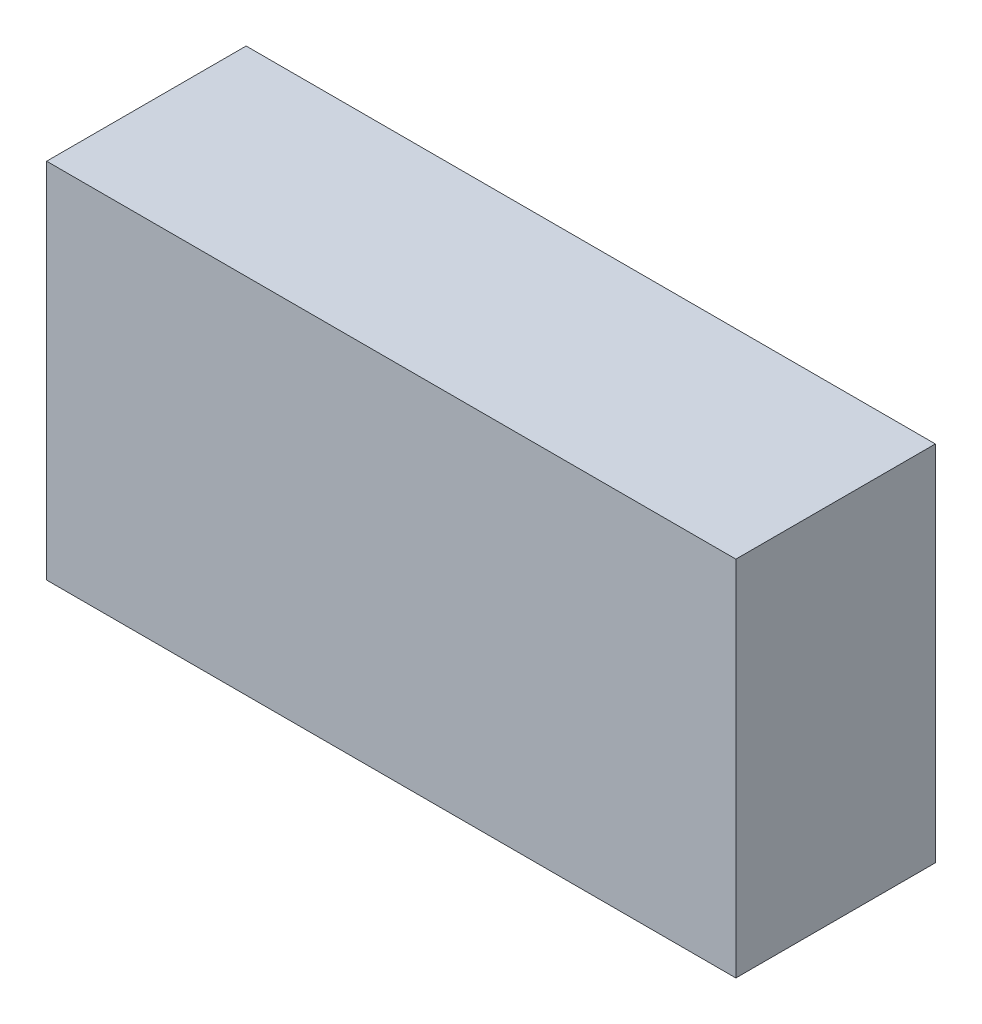
ISO-10303-21;
HEADER;
FILE_DESCRIPTION(('STEP AP214'),'2;1');
FILE_NAME('part.step','',(''),(''),'','','');
FILE_SCHEMA(('AUTOMOTIVE_DESIGN { 1 0 10303 214 1 1 1 1 }'));
ENDSEC;
DATA;
#1=APPLICATION_CONTEXT('core data for automotive mechanical design processes');
#2=APPLICATION_PROTOCOL_DEFINITION('international standard','automotive_design',2000,#1);
#3=PRODUCT_CONTEXT('',#1,'mechanical');
#4=PRODUCT('Part','Part','',(#3));
#5=PRODUCT_RELATED_PRODUCT_CATEGORY('part','',(#4));
#6=PRODUCT_DEFINITION_FORMATION('','',#4);
#7=PRODUCT_DEFINITION_CONTEXT('part definition',#1,'design');
#8=PRODUCT_DEFINITION('design','',#6,#7);
#9=PRODUCT_DEFINITION_SHAPE('','',#8);
#10=(LENGTH_UNIT() NAMED_UNIT(*) SI_UNIT(.MILLI.,.METRE.));
#11=(NAMED_UNIT(*) PLANE_ANGLE_UNIT() SI_UNIT($,.RADIAN.));
#12=(NAMED_UNIT(*) SI_UNIT($,.STERADIAN.) SOLID_ANGLE_UNIT());
#13=UNCERTAINTY_MEASURE_WITH_UNIT(LENGTH_MEASURE(1.E-05),#10,'distance_accuracy_value','');
#14=(GEOMETRIC_REPRESENTATION_CONTEXT(3) GLOBAL_UNCERTAINTY_ASSIGNED_CONTEXT((#13)) GLOBAL_UNIT_ASSIGNED_CONTEXT((#10,
#11,#12)) REPRESENTATION_CONTEXT('',''));
#15=CARTESIAN_POINT('',(0.,0.,0.));
#16=DIRECTION('',(0.,0.,1.));
#17=DIRECTION('',(1.,0.,0.));
#18=AXIS2_PLACEMENT_3D('',#15,#16,#17);
#19=CARTESIAN_POINT('',(0.,0.,11.));
#20=DIRECTION('',(1.,0.,0.));
#21=DIRECTION('',(0.,1.,0.));
#22=AXIS2_PLACEMENT_3D('',#19,#20,#21);
#23=PLANE('',#22);
#24=DIRECTION('',(0.,-1.,0.));
#25=VECTOR('',#24,1.);
#26=CARTESIAN_POINT('',(0.,0.,0.));
#27=LINE('',#26,#25);
#28=CARTESIAN_POINT('',(0.,0.,0.));
#29=VERTEX_POINT('',#28);
#30=CARTESIAN_POINT('',(0.,-20.,0.));
#31=VERTEX_POINT('',#30);
#32=EDGE_CURVE('E106',#29,#31,#27,.T.);
#33=ORIENTED_EDGE('',*,*,#32,.T.);
#34=DIRECTION('',(0.,0.,-1.));
#35=VECTOR('',#34,1.);
#36=CARTESIAN_POINT('',(0.,-20.,11.));
#37=LINE('',#36,#35);
#38=CARTESIAN_POINT('',(0.,-20.,11.));
#39=VERTEX_POINT('',#38);
#40=EDGE_CURVE('E11',#39,#31,#37,.T.);
#41=ORIENTED_EDGE('',*,*,#40,.F.);
#42=DIRECTION('',(0.,-1.,0.));
#43=VECTOR('',#42,1.);
#44=CARTESIAN_POINT('',(0.,0.,11.));
#45=LINE('',#44,#43);
#46=CARTESIAN_POINT('',(0.,0.,11.));
#47=VERTEX_POINT('',#46);
#48=EDGE_CURVE('E94',#47,#39,#45,.T.);
#49=ORIENTED_EDGE('',*,*,#48,.F.);
#50=DIRECTION('',(0.,0.,-1.));
#51=VECTOR('',#50,1.);
#52=CARTESIAN_POINT('',(0.,0.,11.));
#53=LINE('',#52,#51);
#54=EDGE_CURVE('E102',#47,#29,#53,.T.);
#55=ORIENTED_EDGE('',*,*,#54,.T.);
#56=EDGE_LOOP('',(#33,#41,#49,#55));
#57=FACE_BOUND('',#56,.T.);
#58=ADVANCED_FACE('F43',(#57),#23,.F.);
#59=CARTESIAN_POINT('',(0.,-20.,11.));
#60=DIRECTION('',(0.,1.,0.));
#61=DIRECTION('',(0.,0.,1.));
#62=AXIS2_PLACEMENT_3D('',#59,#60,#61);
#63=PLANE('',#62);
#64=DIRECTION('',(1.,0.,0.));
#65=VECTOR('',#64,1.);
#66=CARTESIAN_POINT('',(0.,-20.,0.));
#67=LINE('',#66,#65);
#68=CARTESIAN_POINT('',(38.,-20.,0.));
#69=VERTEX_POINT('',#68);
#70=EDGE_CURVE('E98',#31,#69,#67,.T.);
#71=ORIENTED_EDGE('',*,*,#70,.T.);
#72=DIRECTION('',(0.,0.,-1.));
#73=VECTOR('',#72,1.);
#74=CARTESIAN_POINT('',(38.,-20.,11.));
#75=LINE('',#74,#73);
#76=CARTESIAN_POINT('',(38.,-20.,11.));
#77=VERTEX_POINT('',#76);
#78=EDGE_CURVE('E51',#77,#69,#75,.T.);
#79=ORIENTED_EDGE('',*,*,#78,.F.);
#80=DIRECTION('',(1.,0.,0.));
#81=VECTOR('',#80,1.);
#82=CARTESIAN_POINT('',(0.,-20.,11.));
#83=LINE('',#82,#81);
#84=EDGE_CURVE('E89',#39,#77,#83,.T.);
#85=ORIENTED_EDGE('',*,*,#84,.F.);
#86=ORIENTED_EDGE('',*,*,#40,.T.);
#87=EDGE_LOOP('',(#71,#79,#85,#86));
#88=FACE_BOUND('',#87,.T.);
#89=ADVANCED_FACE('F97',(#88),#63,.F.);
#90=CARTESIAN_POINT('',(38.,0.,11.));
#91=DIRECTION('',(-1.,0.,0.));
#92=DIRECTION('',(0.,0.,1.));
#93=AXIS2_PLACEMENT_3D('',#90,#91,#92);
#94=PLANE('',#93);
#95=DIRECTION('',(0.,1.,0.));
#96=VECTOR('',#95,1.);
#97=CARTESIAN_POINT('',(38.,0.,0.));
#98=LINE('',#97,#96);
#99=CARTESIAN_POINT('',(38.,0.,0.));
#100=VERTEX_POINT('',#99);
#101=EDGE_CURVE('E76',#69,#100,#98,.T.);
#102=ORIENTED_EDGE('',*,*,#101,.T.);
#103=DIRECTION('',(0.,0.,-1.));
#104=VECTOR('',#103,1.);
#105=CARTESIAN_POINT('',(38.,0.,11.));
#106=LINE('',#105,#104);
#107=CARTESIAN_POINT('',(38.,0.,11.));
#108=VERTEX_POINT('',#107);
#109=EDGE_CURVE('E99',#108,#100,#106,.T.);
#110=ORIENTED_EDGE('',*,*,#109,.F.);
#111=DIRECTION('',(0.,1.,0.));
#112=VECTOR('',#111,1.);
#113=CARTESIAN_POINT('',(38.,0.,11.));
#114=LINE('',#113,#112);
#115=EDGE_CURVE('E92',#77,#108,#114,.T.);
#116=ORIENTED_EDGE('',*,*,#115,.F.);
#117=ORIENTED_EDGE('',*,*,#78,.T.);
#118=EDGE_LOOP('',(#102,#110,#116,#117));
#119=FACE_BOUND('',#118,.T.);
#120=ADVANCED_FACE('F100',(#119),#94,.F.);
#121=CARTESIAN_POINT('',(0.,0.,11.));
#122=DIRECTION('',(0.,-1.,0.));
#123=DIRECTION('',(0.,0.,-1.));
#124=AXIS2_PLACEMENT_3D('',#121,#122,#123);
#125=PLANE('',#124);
#126=DIRECTION('',(-1.,0.,0.));
#127=VECTOR('',#126,1.);
#128=CARTESIAN_POINT('',(0.,0.,0.));
#129=LINE('',#128,#127);
#130=EDGE_CURVE('E82',#100,#29,#129,.T.);
#131=ORIENTED_EDGE('',*,*,#130,.T.);
#132=ORIENTED_EDGE('',*,*,#54,.F.);
#133=DIRECTION('',(-1.,0.,0.));
#134=VECTOR('',#133,1.);
#135=CARTESIAN_POINT('',(0.,0.,11.));
#136=LINE('',#135,#134);
#137=EDGE_CURVE('E59',#108,#47,#136,.T.);
#138=ORIENTED_EDGE('',*,*,#137,.F.);
#139=ORIENTED_EDGE('',*,*,#109,.T.);
#140=EDGE_LOOP('',(#131,#132,#138,#139));
#141=FACE_BOUND('',#140,.T.);
#142=ADVANCED_FACE('F113',(#141),#125,.F.);
#143=CARTESIAN_POINT('',(0.,0.,11.));
#144=DIRECTION('',(0.,0.,1.));
#145=DIRECTION('',(1.,0.,0.));
#146=AXIS2_PLACEMENT_3D('',#143,#144,#145);
#147=PLANE('',#146);
#148=ORIENTED_EDGE('',*,*,#48,.T.);
#149=ORIENTED_EDGE('',*,*,#84,.T.);
#150=ORIENTED_EDGE('',*,*,#115,.T.);
#151=ORIENTED_EDGE('',*,*,#137,.T.);
#152=EDGE_LOOP('',(#148,#149,#150,#151));
#153=FACE_BOUND('',#152,.T.);
#154=ADVANCED_FACE('F90',(#153),#147,.T.);
#155=CARTESIAN_POINT('',(0.,0.,0.));
#156=DIRECTION('',(0.,0.,1.));
#157=DIRECTION('',(1.,0.,0.));
#158=AXIS2_PLACEMENT_3D('',#155,#156,#157);
#159=PLANE('',#158);
#160=ORIENTED_EDGE('',*,*,#32,.F.);
#161=ORIENTED_EDGE('',*,*,#130,.F.);
#162=ORIENTED_EDGE('',*,*,#101,.F.);
#163=ORIENTED_EDGE('',*,*,#70,.F.);
#164=EDGE_LOOP('',(#160,#161,#162,#163));
#165=FACE_BOUND('',#164,.T.);
#166=ADVANCED_FACE('F116',(#165),#159,.F.);
#167=CLOSED_SHELL('',(#58,#89,#120,#142,#154,#166));
#168=MANIFOLD_SOLID_BREP('B2',#167);
#169=ADVANCED_BREP_SHAPE_REPRESENTATION('',(#18,#168),#14);
#170=SHAPE_DEFINITION_REPRESENTATION(#9,#169);
ENDSEC;
END-ISO-10303-21;
